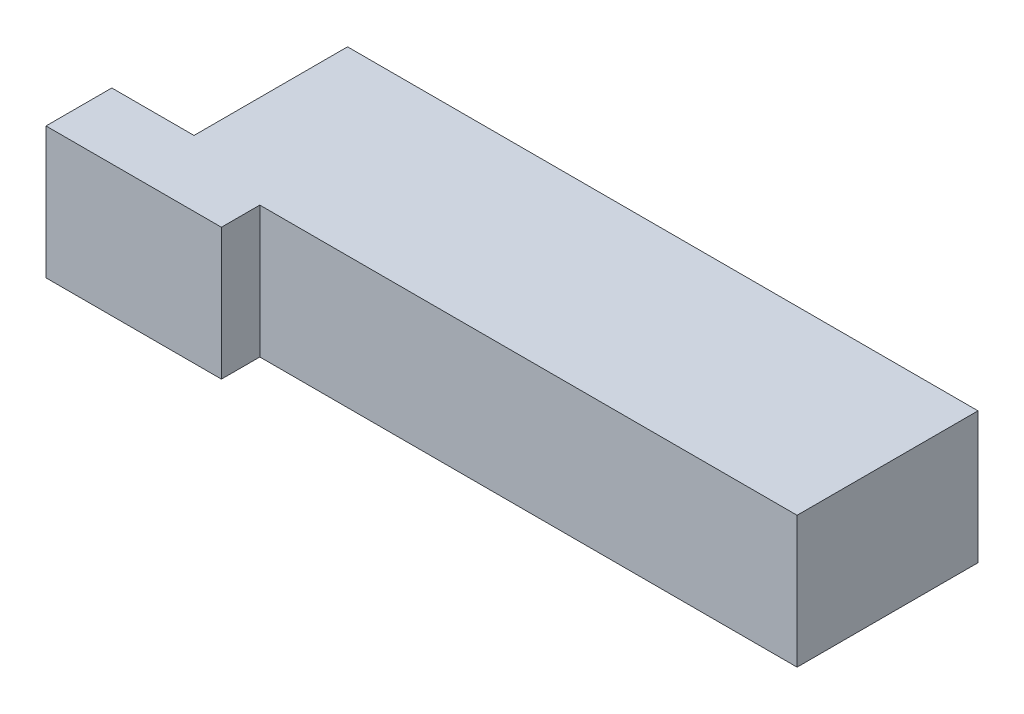
ISO-10303-21;
HEADER;
FILE_DESCRIPTION(('STEP AP214'),'2;1');
FILE_NAME('part.step','',(''),(''),'','','');
FILE_SCHEMA(('AUTOMOTIVE_DESIGN { 1 0 10303 214 1 1 1 1 }'));
ENDSEC;
DATA;
#1=APPLICATION_CONTEXT('core data for automotive mechanical design processes');
#2=APPLICATION_PROTOCOL_DEFINITION('international standard','automotive_design',2000,#1);
#3=PRODUCT_CONTEXT('',#1,'mechanical');
#4=PRODUCT('Part','Part','',(#3));
#5=PRODUCT_RELATED_PRODUCT_CATEGORY('part','',(#4));
#6=PRODUCT_DEFINITION_FORMATION('','',#4);
#7=PRODUCT_DEFINITION_CONTEXT('part definition',#1,'design');
#8=PRODUCT_DEFINITION('design','',#6,#7);
#9=PRODUCT_DEFINITION_SHAPE('','',#8);
#10=(LENGTH_UNIT() NAMED_UNIT(*) SI_UNIT(.MILLI.,.METRE.));
#11=(NAMED_UNIT(*) PLANE_ANGLE_UNIT() SI_UNIT($,.RADIAN.));
#12=(NAMED_UNIT(*) SI_UNIT($,.STERADIAN.) SOLID_ANGLE_UNIT());
#13=UNCERTAINTY_MEASURE_WITH_UNIT(LENGTH_MEASURE(1.E-05),#10,'distance_accuracy_value','');
#14=(GEOMETRIC_REPRESENTATION_CONTEXT(3) GLOBAL_UNCERTAINTY_ASSIGNED_CONTEXT((#13)) GLOBAL_UNIT_ASSIGNED_CONTEXT((#10,
#11,#12)) REPRESENTATION_CONTEXT('',''));
#15=CARTESIAN_POINT('',(0.,0.,0.));
#16=DIRECTION('',(0.,0.,1.));
#17=DIRECTION('',(1.,0.,0.));
#18=AXIS2_PLACEMENT_3D('',#15,#16,#17);
#19=CARTESIAN_POINT('',(-57.5,24.,16.5));
#20=DIRECTION('',(1.,0.,0.));
#21=DIRECTION('',(0.,0.,-1.));
#22=AXIS2_PLACEMENT_3D('',#19,#20,#21);
#23=PLANE('',#22);
#24=DIRECTION('',(0.,-1.,0.));
#25=VECTOR('',#24,1.);
#26=CARTESIAN_POINT('',(-57.5,24.,11.5));
#27=LINE('',#26,#25);
#28=CARTESIAN_POINT('',(-57.5,24.,11.5));
#29=VERTEX_POINT('',#28);
#30=CARTESIAN_POINT('',(-57.5,0.,11.5));
#31=VERTEX_POINT('',#30);
#32=EDGE_CURVE('E65',#29,#31,#27,.T.);
#33=ORIENTED_EDGE('',*,*,#32,.F.);
#34=DIRECTION('',(0.,0.,1.));
#35=VECTOR('',#34,1.);
#36=CARTESIAN_POINT('',(-57.5,24.,16.5));
#37=LINE('',#36,#35);
#38=CARTESIAN_POINT('',(-57.5,24.,-16.5));
#39=VERTEX_POINT('',#38);
#40=EDGE_CURVE('E171',#39,#29,#37,.T.);
#41=ORIENTED_EDGE('',*,*,#40,.F.);
#42=DIRECTION('',(0.,-1.,0.));
#43=VECTOR('',#42,1.);
#44=CARTESIAN_POINT('',(-57.5,24.,-16.5));
#45=LINE('',#44,#43);
#46=CARTESIAN_POINT('',(-57.5,0.,-16.5));
#47=VERTEX_POINT('',#46);
#48=EDGE_CURVE('E50',#39,#47,#45,.T.);
#49=ORIENTED_EDGE('',*,*,#48,.T.);
#50=DIRECTION('',(0.,0.,1.));
#51=VECTOR('',#50,1.);
#52=CARTESIAN_POINT('',(-57.5,0.,16.5));
#53=LINE('',#52,#51);
#54=EDGE_CURVE('E184',#47,#31,#53,.T.);
#55=ORIENTED_EDGE('',*,*,#54,.T.);
#56=EDGE_LOOP('',(#33,#41,#49,#55));
#57=FACE_BOUND('',#56,.T.);
#58=ADVANCED_FACE('F41',(#57),#23,.F.);
#59=CARTESIAN_POINT('',(57.5,24.,16.5));
#60=DIRECTION('',(-1.,0.,0.));
#61=DIRECTION('',(0.,0.,1.));
#62=AXIS2_PLACEMENT_3D('',#59,#60,#61);
#63=PLANE('',#62);
#64=DIRECTION('',(0.,0.,-1.));
#65=VECTOR('',#64,1.);
#66=CARTESIAN_POINT('',(57.5,0.,16.5));
#67=LINE('',#66,#65);
#68=CARTESIAN_POINT('',(57.5,0.,16.5));
#69=VERTEX_POINT('',#68);
#70=CARTESIAN_POINT('',(57.5,0.,-16.5));
#71=VERTEX_POINT('',#70);
#72=EDGE_CURVE('E163',#69,#71,#67,.T.);
#73=ORIENTED_EDGE('',*,*,#72,.T.);
#74=DIRECTION('',(0.,-1.,0.));
#75=VECTOR('',#74,1.);
#76=CARTESIAN_POINT('',(57.5,24.,-16.5));
#77=LINE('',#76,#75);
#78=CARTESIAN_POINT('',(57.5,24.,-16.5));
#79=VERTEX_POINT('',#78);
#80=EDGE_CURVE('E11',#79,#71,#77,.T.);
#81=ORIENTED_EDGE('',*,*,#80,.F.);
#82=DIRECTION('',(0.,0.,-1.));
#83=VECTOR('',#82,1.);
#84=CARTESIAN_POINT('',(57.5,24.,16.5));
#85=LINE('',#84,#83);
#86=CARTESIAN_POINT('',(57.5,24.,16.5));
#87=VERTEX_POINT('',#86);
#88=EDGE_CURVE('E164',#87,#79,#85,.T.);
#89=ORIENTED_EDGE('',*,*,#88,.F.);
#90=DIRECTION('',(0.,-1.,0.));
#91=VECTOR('',#90,1.);
#92=CARTESIAN_POINT('',(57.5,24.,16.5));
#93=LINE('',#92,#91);
#94=EDGE_CURVE('E177',#87,#69,#93,.T.);
#95=ORIENTED_EDGE('',*,*,#94,.T.);
#96=EDGE_LOOP('',(#73,#81,#89,#95));
#97=FACE_BOUND('',#96,.T.);
#98=ADVANCED_FACE('F43',(#97),#63,.F.);
#99=CARTESIAN_POINT('',(-57.5,24.,-16.5));
#100=DIRECTION('',(0.,0.,1.));
#101=DIRECTION('',(1.,0.,0.));
#102=AXIS2_PLACEMENT_3D('',#99,#100,#101);
#103=PLANE('',#102);
#104=DIRECTION('',(-1.,0.,0.));
#105=VECTOR('',#104,1.);
#106=CARTESIAN_POINT('',(-57.5,0.,-16.5));
#107=LINE('',#106,#105);
#108=EDGE_CURVE('E181',#71,#47,#107,.T.);
#109=ORIENTED_EDGE('',*,*,#108,.T.);
#110=ORIENTED_EDGE('',*,*,#48,.F.);
#111=DIRECTION('',(-1.,0.,0.));
#112=VECTOR('',#111,1.);
#113=CARTESIAN_POINT('',(-57.5,24.,-16.5));
#114=LINE('',#113,#112);
#115=EDGE_CURVE('E167',#79,#39,#114,.T.);
#116=ORIENTED_EDGE('',*,*,#115,.F.);
#117=ORIENTED_EDGE('',*,*,#80,.T.);
#118=EDGE_LOOP('',(#109,#110,#116,#117));
#119=FACE_BOUND('',#118,.T.);
#120=ADVANCED_FACE('F217',(#119),#103,.F.);
#121=CARTESIAN_POINT('',(-57.5,24.,16.5));
#122=DIRECTION('',(0.,0.,-1.));
#123=DIRECTION('',(-1.,0.,0.));
#124=AXIS2_PLACEMENT_3D('',#121,#122,#123);
#125=PLANE('',#124);
#126=DIRECTION('',(1.,0.,0.));
#127=VECTOR('',#126,1.);
#128=CARTESIAN_POINT('',(-57.5,24.,16.5));
#129=LINE('',#128,#127);
#130=CARTESIAN_POINT('',(-40.5,24.,16.5));
#131=VERTEX_POINT('',#130);
#132=EDGE_CURVE('E174',#131,#87,#129,.T.);
#133=ORIENTED_EDGE('',*,*,#132,.F.);
#134=DIRECTION('',(0.,-1.,0.));
#135=VECTOR('',#134,1.);
#136=CARTESIAN_POINT('',(-40.5,0.,16.5));
#137=LINE('',#136,#135);
#138=CARTESIAN_POINT('',(-40.5,0.,16.5));
#139=VERTEX_POINT('',#138);
#140=EDGE_CURVE('E137',#131,#139,#137,.T.);
#141=ORIENTED_EDGE('',*,*,#140,.T.);
#142=DIRECTION('',(1.,0.,0.));
#143=VECTOR('',#142,1.);
#144=CARTESIAN_POINT('',(-57.5,0.,16.5));
#145=LINE('',#144,#143);
#146=EDGE_CURVE('E168',#139,#69,#145,.T.);
#147=ORIENTED_EDGE('',*,*,#146,.T.);
#148=ORIENTED_EDGE('',*,*,#94,.F.);
#149=EDGE_LOOP('',(#133,#141,#147,#148));
#150=FACE_BOUND('',#149,.T.);
#151=ADVANCED_FACE('F220',(#150),#125,.F.);
#152=CARTESIAN_POINT('',(0.,24.,0.));
#153=DIRECTION('',(0.,-1.,0.));
#154=DIRECTION('',(0.,0.,-1.));
#155=AXIS2_PLACEMENT_3D('',#152,#153,#154);
#156=PLANE('',#155);
#157=ORIENTED_EDGE('',*,*,#88,.T.);
#158=ORIENTED_EDGE('',*,*,#115,.T.);
#159=ORIENTED_EDGE('',*,*,#40,.T.);
#160=DIRECTION('',(1.,0.,0.));
#161=VECTOR('',#160,1.);
#162=CARTESIAN_POINT('',(-72.5,24.,11.5));
#163=LINE('',#162,#161);
#164=CARTESIAN_POINT('',(-72.5,24.,11.5));
#165=VERTEX_POINT('',#164);
#166=EDGE_CURVE('E118',#165,#29,#163,.T.);
#167=ORIENTED_EDGE('',*,*,#166,.F.);
#168=DIRECTION('',(0.,0.,-1.));
#169=VECTOR('',#168,1.);
#170=CARTESIAN_POINT('',(-72.5,24.,16.5));
#171=LINE('',#170,#169);
#172=CARTESIAN_POINT('',(-72.5,24.,23.5));
#173=VERTEX_POINT('',#172);
#174=EDGE_CURVE('E110',#173,#165,#171,.T.);
#175=ORIENTED_EDGE('',*,*,#174,.F.);
#176=DIRECTION('',(-1.,0.,0.));
#177=VECTOR('',#176,1.);
#178=CARTESIAN_POINT('',(0.,24.,23.5));
#179=LINE('',#178,#177);
#180=CARTESIAN_POINT('',(-40.5,24.,23.5));
#181=VERTEX_POINT('',#180);
#182=EDGE_CURVE('E115',#181,#173,#179,.T.);
#183=ORIENTED_EDGE('',*,*,#182,.F.);
#184=DIRECTION('',(0.,0.,-1.));
#185=VECTOR('',#184,1.);
#186=CARTESIAN_POINT('',(-40.5,24.,23.5));
#187=LINE('',#186,#185);
#188=EDGE_CURVE('E145',#181,#131,#187,.T.);
#189=ORIENTED_EDGE('',*,*,#188,.T.);
#190=ORIENTED_EDGE('',*,*,#132,.T.);
#191=EDGE_LOOP('',(#157,#158,#159,#167,#175,#183,#189,#190));
#192=FACE_BOUND('',#191,.T.);
#193=ADVANCED_FACE('F113',(#192),#156,.F.);
#194=CARTESIAN_POINT('',(0.,0.,0.));
#195=DIRECTION('',(0.,-1.,0.));
#196=DIRECTION('',(0.,0.,-1.));
#197=AXIS2_PLACEMENT_3D('',#194,#195,#196);
#198=PLANE('',#197);
#199=ORIENTED_EDGE('',*,*,#72,.F.);
#200=ORIENTED_EDGE('',*,*,#146,.F.);
#201=DIRECTION('',(0.,0.,-1.));
#202=VECTOR('',#201,1.);
#203=CARTESIAN_POINT('',(-40.5,0.,23.5));
#204=LINE('',#203,#202);
#205=CARTESIAN_POINT('',(-40.5,0.,23.5));
#206=VERTEX_POINT('',#205);
#207=EDGE_CURVE('E57',#206,#139,#204,.T.);
#208=ORIENTED_EDGE('',*,*,#207,.F.);
#209=DIRECTION('',(1.,0.,0.));
#210=VECTOR('',#209,1.);
#211=CARTESIAN_POINT('',(0.,0.,23.5));
#212=LINE('',#211,#210);
#213=CARTESIAN_POINT('',(-72.5,0.,23.5));
#214=VERTEX_POINT('',#213);
#215=EDGE_CURVE('E132',#214,#206,#212,.T.);
#216=ORIENTED_EDGE('',*,*,#215,.F.);
#217=DIRECTION('',(0.,0.,1.));
#218=VECTOR('',#217,1.);
#219=CARTESIAN_POINT('',(-72.5,0.,16.5));
#220=LINE('',#219,#218);
#221=CARTESIAN_POINT('',(-72.5,0.,11.5));
#222=VERTEX_POINT('',#221);
#223=EDGE_CURVE('E128',#222,#214,#220,.T.);
#224=ORIENTED_EDGE('',*,*,#223,.F.);
#225=DIRECTION('',(1.,0.,0.));
#226=VECTOR('',#225,1.);
#227=CARTESIAN_POINT('',(-72.5,0.,11.5));
#228=LINE('',#227,#226);
#229=EDGE_CURVE('E155',#222,#31,#228,.T.);
#230=ORIENTED_EDGE('',*,*,#229,.T.);
#231=ORIENTED_EDGE('',*,*,#54,.F.);
#232=ORIENTED_EDGE('',*,*,#108,.F.);
#233=EDGE_LOOP('',(#199,#200,#208,#216,#224,#230,#231,#232));
#234=FACE_BOUND('',#233,.T.);
#235=ADVANCED_FACE('F198',(#234),#198,.T.);
#236=CARTESIAN_POINT('',(-72.5,24.,11.5));
#237=DIRECTION('',(0.,0.,1.));
#238=DIRECTION('',(0.,-1.,0.));
#239=AXIS2_PLACEMENT_3D('',#236,#237,#238);
#240=PLANE('',#239);
#241=ORIENTED_EDGE('',*,*,#32,.T.);
#242=ORIENTED_EDGE('',*,*,#229,.F.);
#243=DIRECTION('',(0.,-1.,0.));
#244=VECTOR('',#243,1.);
#245=CARTESIAN_POINT('',(-72.5,24.,11.5));
#246=LINE('',#245,#244);
#247=EDGE_CURVE('E122',#165,#222,#246,.T.);
#248=ORIENTED_EDGE('',*,*,#247,.F.);
#249=ORIENTED_EDGE('',*,*,#166,.T.);
#250=EDGE_LOOP('',(#241,#242,#248,#249));
#251=FACE_BOUND('',#250,.T.);
#252=ADVANCED_FACE('F201',(#251),#240,.F.);
#253=CARTESIAN_POINT('',(-72.5,0.,0.));
#254=DIRECTION('',(1.,0.,0.));
#255=DIRECTION('',(0.,0.,-1.));
#256=AXIS2_PLACEMENT_3D('',#253,#254,#255);
#257=PLANE('',#256);
#258=ORIENTED_EDGE('',*,*,#223,.T.);
#259=DIRECTION('',(0.,-1.,0.));
#260=VECTOR('',#259,1.);
#261=CARTESIAN_POINT('',(-72.5,0.,23.5));
#262=LINE('',#261,#260);
#263=EDGE_CURVE('E125',#173,#214,#262,.T.);
#264=ORIENTED_EDGE('',*,*,#263,.F.);
#265=ORIENTED_EDGE('',*,*,#174,.T.);
#266=ORIENTED_EDGE('',*,*,#247,.T.);
#267=EDGE_LOOP('',(#258,#264,#265,#266));
#268=FACE_BOUND('',#267,.T.);
#269=ADVANCED_FACE('F126',(#268),#257,.F.);
#270=CARTESIAN_POINT('',(-40.5,0.,23.5));
#271=DIRECTION('',(1.,0.,0.));
#272=DIRECTION('',(0.,0.,-1.));
#273=AXIS2_PLACEMENT_3D('',#270,#271,#272);
#274=PLANE('',#273);
#275=ORIENTED_EDGE('',*,*,#140,.F.);
#276=ORIENTED_EDGE('',*,*,#188,.F.);
#277=DIRECTION('',(0.,-1.,0.));
#278=VECTOR('',#277,1.);
#279=CARTESIAN_POINT('',(-40.5,0.,23.5));
#280=LINE('',#279,#278);
#281=EDGE_CURVE('E135',#181,#206,#280,.T.);
#282=ORIENTED_EDGE('',*,*,#281,.T.);
#283=ORIENTED_EDGE('',*,*,#207,.T.);
#284=EDGE_LOOP('',(#275,#276,#282,#283));
#285=FACE_BOUND('',#284,.T.);
#286=ADVANCED_FACE('F208',(#285),#274,.T.);
#287=CARTESIAN_POINT('',(0.,0.,23.5));
#288=DIRECTION('',(0.,0.,1.));
#289=DIRECTION('',(1.,0.,0.));
#290=AXIS2_PLACEMENT_3D('',#287,#288,#289);
#291=PLANE('',#290);
#292=ORIENTED_EDGE('',*,*,#182,.T.);
#293=ORIENTED_EDGE('',*,*,#263,.T.);
#294=ORIENTED_EDGE('',*,*,#215,.T.);
#295=ORIENTED_EDGE('',*,*,#281,.F.);
#296=EDGE_LOOP('',(#292,#293,#294,#295));
#297=FACE_BOUND('',#296,.T.);
#298=ADVANCED_FACE('F134',(#297),#291,.T.);
#299=CLOSED_SHELL('',(#58,#98,#120,#151,#193,#235,#252,#269,#286,#298));
#300=MANIFOLD_SOLID_BREP('B2',#299);
#301=ADVANCED_BREP_SHAPE_REPRESENTATION('',(#18,#300),#14);
#302=SHAPE_DEFINITION_REPRESENTATION(#9,#301);
ENDSEC;
END-ISO-10303-21;
